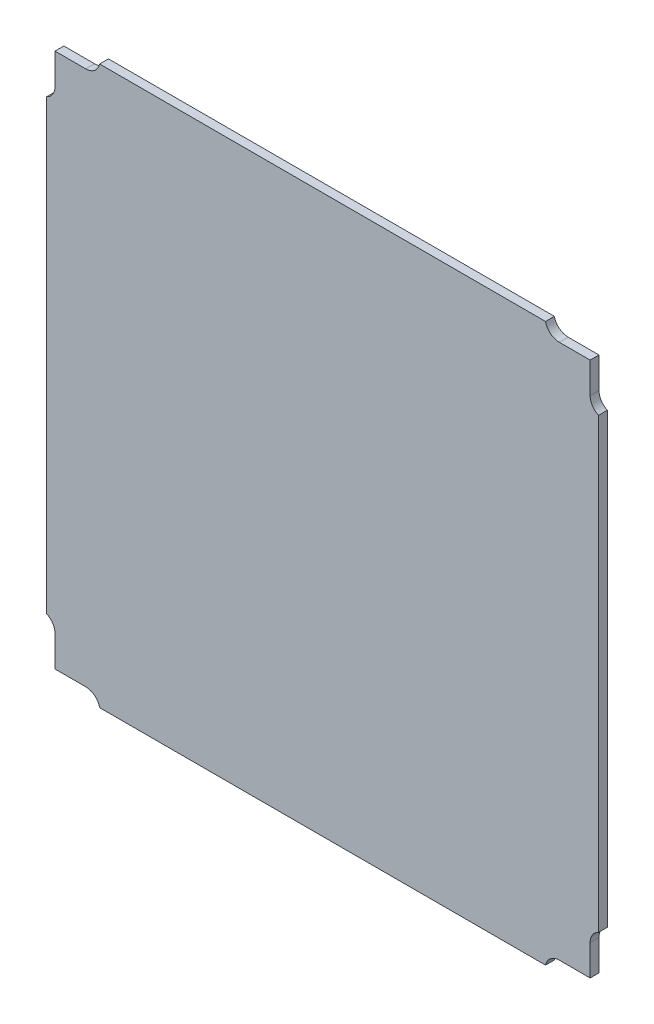
ISO-10303-21;
HEADER;
FILE_DESCRIPTION(('STEP AP214'),'2;1');
FILE_NAME('part.step','',(''),(''),'','','');
FILE_SCHEMA(('AUTOMOTIVE_DESIGN { 1 0 10303 214 1 1 1 1 }'));
ENDSEC;
DATA;
#1=APPLICATION_CONTEXT('core data for automotive mechanical design processes');
#2=APPLICATION_PROTOCOL_DEFINITION('international standard','automotive_design',2000,#1);
#3=PRODUCT_CONTEXT('',#1,'mechanical');
#4=PRODUCT('Part','Part','',(#3));
#5=PRODUCT_RELATED_PRODUCT_CATEGORY('part','',(#4));
#6=PRODUCT_DEFINITION_FORMATION('','',#4);
#7=PRODUCT_DEFINITION_CONTEXT('part definition',#1,'design');
#8=PRODUCT_DEFINITION('design','',#6,#7);
#9=PRODUCT_DEFINITION_SHAPE('','',#8);
#10=(LENGTH_UNIT() NAMED_UNIT(*) SI_UNIT(.MILLI.,.METRE.));
#11=(NAMED_UNIT(*) PLANE_ANGLE_UNIT() SI_UNIT($,.RADIAN.));
#12=(NAMED_UNIT(*) SI_UNIT($,.STERADIAN.) SOLID_ANGLE_UNIT());
#13=UNCERTAINTY_MEASURE_WITH_UNIT(LENGTH_MEASURE(1.E-05),#10,'distance_accuracy_value','');
#14=(GEOMETRIC_REPRESENTATION_CONTEXT(3) GLOBAL_UNCERTAINTY_ASSIGNED_CONTEXT((#13)) GLOBAL_UNIT_ASSIGNED_CONTEXT((#10,
#11,#12)) REPRESENTATION_CONTEXT('',''));
#15=CARTESIAN_POINT('',(0.,0.,0.));
#16=DIRECTION('',(0.,0.,1.));
#17=DIRECTION('',(1.,0.,0.));
#18=AXIS2_PLACEMENT_3D('',#15,#16,#17);
#19=CARTESIAN_POINT('',(0.,0.,1.5875));
#20=DIRECTION('',(0.,0.,1.));
#21=DIRECTION('',(1.,0.,0.));
#22=AXIS2_PLACEMENT_3D('',#19,#20,#21);
#23=PLANE('',#22);
#24=CARTESIAN_POINT('',(-50.54,42.4819347291982,1.5875));
#25=DIRECTION('',(0.,0.,1.));
#26=DIRECTION('',(1.,0.,0.));
#27=AXIS2_PLACEMENT_3D('',#24,#25,#26);
#28=CIRCLE('',#27,2.54);
#29=CARTESIAN_POINT('',(-48.,42.4819347291981,1.5875));
#30=VERTEX_POINT('',#29);
#31=CARTESIAN_POINT('',(-49.5,40.1646086839469,1.5875));
#32=VERTEX_POINT('',#31);
#33=EDGE_CURVE('E188',#30,#32,#28,.F.);
#34=ORIENTED_EDGE('',*,*,#33,.T.);
#35=DIRECTION('',(0.,-1.,0.));
#36=VECTOR('',#35,1.);
#37=CARTESIAN_POINT('',(-49.5,50.,1.5875));
#38=LINE('',#37,#36);
#39=CARTESIAN_POINT('',(-49.5,-40.1646086839469,1.5875));
#40=VERTEX_POINT('',#39);
#41=EDGE_CURVE('E61',#32,#40,#38,.T.);
#42=ORIENTED_EDGE('',*,*,#41,.T.);
#43=CARTESIAN_POINT('',(-50.54,-42.4819347291982,1.5875));
#44=DIRECTION('',(0.,0.,1.));
#45=DIRECTION('',(1.,0.,0.));
#46=AXIS2_PLACEMENT_3D('',#43,#44,#45);
#47=CIRCLE('',#46,2.54);
#48=CARTESIAN_POINT('',(-48.,-42.4819347291982,1.5875));
#49=VERTEX_POINT('',#48);
#50=EDGE_CURVE('E184',#40,#49,#47,.F.);
#51=ORIENTED_EDGE('',*,*,#50,.T.);
#52=DIRECTION('',(0.,-1.,0.));
#53=VECTOR('',#52,1.);
#54=CARTESIAN_POINT('',(-47.9999999999999,0.,1.5875));
#55=LINE('',#54,#53);
#56=CARTESIAN_POINT('',(-48.,-48.,1.5875));
#57=VERTEX_POINT('',#56);
#58=EDGE_CURVE('E281',#49,#57,#55,.T.);
#59=ORIENTED_EDGE('',*,*,#58,.T.);
#60=DIRECTION('',(1.,0.,0.));
#61=VECTOR('',#60,1.);
#62=CARTESIAN_POINT('',(0.,-48.0000000000001,1.5875));
#63=LINE('',#62,#61);
#64=CARTESIAN_POINT('',(-42.4819347291981,-48.,1.5875));
#65=VERTEX_POINT('',#64);
#66=EDGE_CURVE('E284',#57,#65,#63,.T.);
#67=ORIENTED_EDGE('',*,*,#66,.T.);
#68=CARTESIAN_POINT('',(-42.4819347291981,-50.54,1.5875));
#69=DIRECTION('',(0.,0.,1.));
#70=DIRECTION('',(1.,0.,0.));
#71=AXIS2_PLACEMENT_3D('',#68,#69,#70);
#72=CIRCLE('',#71,2.54);
#73=CARTESIAN_POINT('',(-40.,-50.,1.5875));
#74=VERTEX_POINT('',#73);
#75=EDGE_CURVE('E198',#65,#74,#72,.F.);
#76=ORIENTED_EDGE('',*,*,#75,.T.);
#77=DIRECTION('',(1.,0.,0.));
#78=VECTOR('',#77,1.);
#79=CARTESIAN_POINT('',(0.,-50.,1.5875));
#80=LINE('',#79,#78);
#81=CARTESIAN_POINT('',(40.,-50.,1.5875));
#82=VERTEX_POINT('',#81);
#83=EDGE_CURVE('E326',#74,#82,#80,.T.);
#84=ORIENTED_EDGE('',*,*,#83,.T.);
#85=CARTESIAN_POINT('',(42.4819347291982,-50.54,1.5875));
#86=DIRECTION('',(0.,0.,1.));
#87=DIRECTION('',(1.,0.,0.));
#88=AXIS2_PLACEMENT_3D('',#85,#86,#87);
#89=CIRCLE('',#88,2.54);
#90=CARTESIAN_POINT('',(42.4819347291982,-48.,1.5875));
#91=VERTEX_POINT('',#90);
#92=EDGE_CURVE('E207',#82,#91,#89,.F.);
#93=ORIENTED_EDGE('',*,*,#92,.T.);
#94=DIRECTION('',(1.,0.,0.));
#95=VECTOR('',#94,1.);
#96=CARTESIAN_POINT('',(-1.2490009027033E-13,-47.9999999999999,1.5875));
#97=LINE('',#96,#95);
#98=CARTESIAN_POINT('',(48.,-48.,1.5875));
#99=VERTEX_POINT('',#98);
#100=EDGE_CURVE('E324',#91,#99,#97,.T.);
#101=ORIENTED_EDGE('',*,*,#100,.T.);
#102=DIRECTION('',(0.,1.,0.));
#103=VECTOR('',#102,1.);
#104=CARTESIAN_POINT('',(48.0000000000001,0.,1.5875));
#105=LINE('',#104,#103);
#106=CARTESIAN_POINT('',(48.,-42.4819347291982,1.5875));
#107=VERTEX_POINT('',#106);
#108=EDGE_CURVE('E321',#99,#107,#105,.T.);
#109=ORIENTED_EDGE('',*,*,#108,.T.);
#110=CARTESIAN_POINT('',(50.54,-42.4819347291982,1.5875));
#111=DIRECTION('',(0.,0.,1.));
#112=DIRECTION('',(1.,0.,0.));
#113=AXIS2_PLACEMENT_3D('',#110,#111,#112);
#114=CIRCLE('',#113,2.54);
#115=CARTESIAN_POINT('',(49.5,-40.1646086839469,1.5875));
#116=VERTEX_POINT('',#115);
#117=EDGE_CURVE('E211',#107,#116,#114,.F.);
#118=ORIENTED_EDGE('',*,*,#117,.T.);
#119=DIRECTION('',(0.,1.,0.));
#120=VECTOR('',#119,1.);
#121=CARTESIAN_POINT('',(49.5,50.,1.5875));
#122=LINE('',#121,#120);
#123=CARTESIAN_POINT('',(49.5,40.1646086839469,1.5875));
#124=VERTEX_POINT('',#123);
#125=EDGE_CURVE('E189',#116,#124,#122,.T.);
#126=ORIENTED_EDGE('',*,*,#125,.T.);
#127=CARTESIAN_POINT('',(50.54,42.4819347291981,1.5875));
#128=DIRECTION('',(0.,0.,1.));
#129=DIRECTION('',(1.,0.,0.));
#130=AXIS2_PLACEMENT_3D('',#127,#128,#129);
#131=CIRCLE('',#130,2.54);
#132=CARTESIAN_POINT('',(48.,42.4819347291982,1.5875));
#133=VERTEX_POINT('',#132);
#134=EDGE_CURVE('E217',#124,#133,#131,.F.);
#135=ORIENTED_EDGE('',*,*,#134,.T.);
#136=DIRECTION('',(0.,1.,0.));
#137=VECTOR('',#136,1.);
#138=CARTESIAN_POINT('',(47.9999999999999,-1.2490009027033E-13,1.5875));
#139=LINE('',#138,#137);
#140=CARTESIAN_POINT('',(48.,48.,1.5875));
#141=VERTEX_POINT('',#140);
#142=EDGE_CURVE('E319',#133,#141,#139,.T.);
#143=ORIENTED_EDGE('',*,*,#142,.T.);
#144=DIRECTION('',(-1.,0.,0.));
#145=VECTOR('',#144,1.);
#146=CARTESIAN_POINT('',(1.2490009027033E-13,48.0000000000001,1.5875));
#147=LINE('',#146,#145);
#148=CARTESIAN_POINT('',(42.4819347291982,48.,1.5875));
#149=VERTEX_POINT('',#148);
#150=EDGE_CURVE('E316',#141,#149,#147,.T.);
#151=ORIENTED_EDGE('',*,*,#150,.T.);
#152=CARTESIAN_POINT('',(42.4819347291982,50.54,1.5875));
#153=DIRECTION('',(0.,0.,1.));
#154=DIRECTION('',(1.,0.,0.));
#155=AXIS2_PLACEMENT_3D('',#152,#153,#154);
#156=CIRCLE('',#155,2.54);
#157=CARTESIAN_POINT('',(40.,50.,1.5875));
#158=VERTEX_POINT('',#157);
#159=EDGE_CURVE('E221',#149,#158,#156,.F.);
#160=ORIENTED_EDGE('',*,*,#159,.T.);
#161=DIRECTION('',(1.,0.,0.));
#162=VECTOR('',#161,1.);
#163=CARTESIAN_POINT('',(0.,50.,1.5875));
#164=LINE('',#163,#162);
#165=CARTESIAN_POINT('',(-40.,50.,1.5875));
#166=VERTEX_POINT('',#165);
#167=EDGE_CURVE('E313',#166,#158,#164,.T.);
#168=ORIENTED_EDGE('',*,*,#167,.F.);
#169=CARTESIAN_POINT('',(-42.4819347291982,50.54,1.5875));
#170=DIRECTION('',(0.,0.,1.));
#171=DIRECTION('',(1.,0.,0.));
#172=AXIS2_PLACEMENT_3D('',#169,#170,#171);
#173=CIRCLE('',#172,2.54);
#174=CARTESIAN_POINT('',(-42.4819347291982,48.,1.5875));
#175=VERTEX_POINT('',#174);
#176=EDGE_CURVE('E225',#166,#175,#173,.F.);
#177=ORIENTED_EDGE('',*,*,#176,.T.);
#178=DIRECTION('',(-1.,0.,0.));
#179=VECTOR('',#178,1.);
#180=CARTESIAN_POINT('',(0.,47.9999999999999,1.5875));
#181=LINE('',#180,#179);
#182=CARTESIAN_POINT('',(-48.,48.,1.5875));
#183=VERTEX_POINT('',#182);
#184=EDGE_CURVE('E311',#175,#183,#181,.T.);
#185=ORIENTED_EDGE('',*,*,#184,.T.);
#186=DIRECTION('',(0.,-1.,0.));
#187=VECTOR('',#186,1.);
#188=CARTESIAN_POINT('',(-48.0000000000001,0.,1.5875));
#189=LINE('',#188,#187);
#190=EDGE_CURVE('E309',#183,#30,#189,.T.);
#191=ORIENTED_EDGE('',*,*,#190,.T.);
#192=EDGE_LOOP('',(#34,#42,#51,#59,#67,#76,#84,#93,#101,#109,#118,#126,#135,#143,#151,#160,#168,
#177,#185,#191));
#193=FACE_BOUND('',#192,.T.);
#194=ADVANCED_FACE('F39',(#193),#23,.T.);
#195=CARTESIAN_POINT('',(0.,0.,0.));
#196=DIRECTION('',(0.,0.,1.));
#197=DIRECTION('',(1.,0.,0.));
#198=AXIS2_PLACEMENT_3D('',#195,#196,#197);
#199=PLANE('',#198);
#200=DIRECTION('',(0.,-1.,0.));
#201=VECTOR('',#200,1.);
#202=CARTESIAN_POINT('',(-49.5,50.,0.));
#203=LINE('',#202,#201);
#204=CARTESIAN_POINT('',(-49.5,40.1646086839469,0.));
#205=VERTEX_POINT('',#204);
#206=CARTESIAN_POINT('',(-49.5,-40.1646086839469,0.));
#207=VERTEX_POINT('',#206);
#208=EDGE_CURVE('E176',#205,#207,#203,.T.);
#209=ORIENTED_EDGE('',*,*,#208,.F.);
#210=CARTESIAN_POINT('',(-50.54,42.4819347291982,0.));
#211=DIRECTION('',(0.,0.,1.));
#212=DIRECTION('',(1.,0.,0.));
#213=AXIS2_PLACEMENT_3D('',#210,#211,#212);
#214=CIRCLE('',#213,2.54);
#215=CARTESIAN_POINT('',(-48.,42.4819347291981,0.));
#216=VERTEX_POINT('',#215);
#217=EDGE_CURVE('E227',#205,#216,#214,.T.);
#218=ORIENTED_EDGE('',*,*,#217,.T.);
#219=DIRECTION('',(0.,-1.,0.));
#220=VECTOR('',#219,1.);
#221=CARTESIAN_POINT('',(-48.0000000000001,0.,0.));
#222=LINE('',#221,#220);
#223=CARTESIAN_POINT('',(-48.,48.,0.));
#224=VERTEX_POINT('',#223);
#225=EDGE_CURVE('E285',#224,#216,#222,.T.);
#226=ORIENTED_EDGE('',*,*,#225,.F.);
#227=DIRECTION('',(-1.,0.,0.));
#228=VECTOR('',#227,1.);
#229=CARTESIAN_POINT('',(0.,47.9999999999999,0.));
#230=LINE('',#229,#228);
#231=CARTESIAN_POINT('',(-42.4819347291982,48.,0.));
#232=VERTEX_POINT('',#231);
#233=EDGE_CURVE('E287',#232,#224,#230,.T.);
#234=ORIENTED_EDGE('',*,*,#233,.F.);
#235=CARTESIAN_POINT('',(-42.4819347291982,50.54,0.));
#236=DIRECTION('',(0.,0.,1.));
#237=DIRECTION('',(1.,0.,0.));
#238=AXIS2_PLACEMENT_3D('',#235,#236,#237);
#239=CIRCLE('',#238,2.54);
#240=CARTESIAN_POINT('',(-40.,50.,0.));
#241=VERTEX_POINT('',#240);
#242=EDGE_CURVE('E223',#232,#241,#239,.T.);
#243=ORIENTED_EDGE('',*,*,#242,.T.);
#244=DIRECTION('',(1.,0.,0.));
#245=VECTOR('',#244,1.);
#246=CARTESIAN_POINT('',(0.,50.,0.));
#247=LINE('',#246,#245);
#248=CARTESIAN_POINT('',(40.,50.,0.));
#249=VERTEX_POINT('',#248);
#250=EDGE_CURVE('E289',#241,#249,#247,.T.);
#251=ORIENTED_EDGE('',*,*,#250,.T.);
#252=CARTESIAN_POINT('',(42.4819347291982,50.54,0.));
#253=DIRECTION('',(0.,0.,1.));
#254=DIRECTION('',(1.,0.,0.));
#255=AXIS2_PLACEMENT_3D('',#252,#253,#254);
#256=CIRCLE('',#255,2.54);
#257=CARTESIAN_POINT('',(42.4819347291982,48.,0.));
#258=VERTEX_POINT('',#257);
#259=EDGE_CURVE('E219',#249,#258,#256,.T.);
#260=ORIENTED_EDGE('',*,*,#259,.T.);
#261=DIRECTION('',(-1.,0.,0.));
#262=VECTOR('',#261,1.);
#263=CARTESIAN_POINT('',(1.2490009027033E-13,48.0000000000001,0.));
#264=LINE('',#263,#262);
#265=CARTESIAN_POINT('',(48.,48.,0.));
#266=VERTEX_POINT('',#265);
#267=EDGE_CURVE('E292',#266,#258,#264,.T.);
#268=ORIENTED_EDGE('',*,*,#267,.F.);
#269=DIRECTION('',(0.,1.,0.));
#270=VECTOR('',#269,1.);
#271=CARTESIAN_POINT('',(47.9999999999999,-1.2490009027033E-13,0.));
#272=LINE('',#271,#270);
#273=CARTESIAN_POINT('',(48.,42.4819347291982,0.));
#274=VERTEX_POINT('',#273);
#275=EDGE_CURVE('E295',#274,#266,#272,.T.);
#276=ORIENTED_EDGE('',*,*,#275,.F.);
#277=CARTESIAN_POINT('',(50.54,42.4819347291981,0.));
#278=DIRECTION('',(0.,0.,1.));
#279=DIRECTION('',(1.,0.,0.));
#280=AXIS2_PLACEMENT_3D('',#277,#278,#279);
#281=CIRCLE('',#280,2.54);
#282=CARTESIAN_POINT('',(49.5,40.1646086839469,0.));
#283=VERTEX_POINT('',#282);
#284=EDGE_CURVE('E214',#274,#283,#281,.T.);
#285=ORIENTED_EDGE('',*,*,#284,.T.);
#286=DIRECTION('',(0.,1.,0.));
#287=VECTOR('',#286,1.);
#288=CARTESIAN_POINT('',(49.5,50.,0.));
#289=LINE('',#288,#287);
#290=CARTESIAN_POINT('',(49.5,-40.1646086839469,0.));
#291=VERTEX_POINT('',#290);
#292=EDGE_CURVE('E53',#291,#283,#289,.T.);
#293=ORIENTED_EDGE('',*,*,#292,.F.);
#294=CARTESIAN_POINT('',(50.54,-42.4819347291982,0.));
#295=DIRECTION('',(0.,0.,1.));
#296=DIRECTION('',(1.,0.,0.));
#297=AXIS2_PLACEMENT_3D('',#294,#295,#296);
#298=CIRCLE('',#297,2.54);
#299=CARTESIAN_POINT('',(48.,-42.4819347291982,0.));
#300=VERTEX_POINT('',#299);
#301=EDGE_CURVE('E209',#291,#300,#298,.T.);
#302=ORIENTED_EDGE('',*,*,#301,.T.);
#303=DIRECTION('',(0.,1.,0.));
#304=VECTOR('',#303,1.);
#305=CARTESIAN_POINT('',(48.0000000000001,0.,0.));
#306=LINE('',#305,#304);
#307=CARTESIAN_POINT('',(48.,-48.,0.));
#308=VERTEX_POINT('',#307);
#309=EDGE_CURVE('E297',#308,#300,#306,.T.);
#310=ORIENTED_EDGE('',*,*,#309,.F.);
#311=DIRECTION('',(1.,0.,0.));
#312=VECTOR('',#311,1.);
#313=CARTESIAN_POINT('',(-1.2490009027033E-13,-47.9999999999999,0.));
#314=LINE('',#313,#312);
#315=CARTESIAN_POINT('',(42.4819347291982,-48.,0.));
#316=VERTEX_POINT('',#315);
#317=EDGE_CURVE('E300',#316,#308,#314,.T.);
#318=ORIENTED_EDGE('',*,*,#317,.F.);
#319=CARTESIAN_POINT('',(42.4819347291982,-50.54,0.));
#320=DIRECTION('',(0.,0.,1.));
#321=DIRECTION('',(1.,0.,0.));
#322=AXIS2_PLACEMENT_3D('',#319,#320,#321);
#323=CIRCLE('',#322,2.54);
#324=CARTESIAN_POINT('',(40.,-50.,0.));
#325=VERTEX_POINT('',#324);
#326=EDGE_CURVE('E205',#316,#325,#323,.T.);
#327=ORIENTED_EDGE('',*,*,#326,.T.);
#328=DIRECTION('',(1.,0.,0.));
#329=VECTOR('',#328,1.);
#330=CARTESIAN_POINT('',(0.,-50.,0.));
#331=LINE('',#330,#329);
#332=CARTESIAN_POINT('',(-40.,-50.,0.));
#333=VERTEX_POINT('',#332);
#334=EDGE_CURVE('E302',#333,#325,#331,.T.);
#335=ORIENTED_EDGE('',*,*,#334,.F.);
#336=CARTESIAN_POINT('',(-42.4819347291981,-50.54,0.));
#337=DIRECTION('',(0.,0.,1.));
#338=DIRECTION('',(1.,0.,0.));
#339=AXIS2_PLACEMENT_3D('',#336,#337,#338);
#340=CIRCLE('',#339,2.54);
#341=CARTESIAN_POINT('',(-42.4819347291981,-48.,0.));
#342=VERTEX_POINT('',#341);
#343=EDGE_CURVE('E195',#333,#342,#340,.T.);
#344=ORIENTED_EDGE('',*,*,#343,.T.);
#345=DIRECTION('',(1.,0.,0.));
#346=VECTOR('',#345,1.);
#347=CARTESIAN_POINT('',(0.,-48.0000000000001,0.));
#348=LINE('',#347,#346);
#349=CARTESIAN_POINT('',(-48.,-48.,0.));
#350=VERTEX_POINT('',#349);
#351=EDGE_CURVE('E305',#350,#342,#348,.T.);
#352=ORIENTED_EDGE('',*,*,#351,.F.);
#353=DIRECTION('',(0.,-1.,0.));
#354=VECTOR('',#353,1.);
#355=CARTESIAN_POINT('',(-47.9999999999999,0.,0.));
#356=LINE('',#355,#354);
#357=CARTESIAN_POINT('',(-48.,-42.4819347291982,0.));
#358=VERTEX_POINT('',#357);
#359=EDGE_CURVE('E282',#358,#350,#356,.T.);
#360=ORIENTED_EDGE('',*,*,#359,.F.);
#361=CARTESIAN_POINT('',(-50.54,-42.4819347291982,0.));
#362=DIRECTION('',(0.,0.,1.));
#363=DIRECTION('',(1.,0.,0.));
#364=AXIS2_PLACEMENT_3D('',#361,#362,#363);
#365=CIRCLE('',#364,2.54);
#366=EDGE_CURVE('E196',#358,#207,#365,.T.);
#367=ORIENTED_EDGE('',*,*,#366,.T.);
#368=EDGE_LOOP('',(#209,#218,#226,#234,#243,#251,#260,#268,#276,#285,#293,#302,#310,#318,#327,
#335,#344,#352,#360,#367));
#369=FACE_BOUND('',#368,.T.);
#370=ADVANCED_FACE('F232',(#369),#199,.F.);
#371=CARTESIAN_POINT('',(-50.54,-42.4819347291982,1.5875));
#372=DIRECTION('',(0.,0.,1.));
#373=DIRECTION('',(1.,0.,0.));
#374=AXIS2_PLACEMENT_3D('',#371,#372,#373);
#375=CYLINDRICAL_SURFACE('',#374,2.54);
#376=DIRECTION('',(0.,0.,1.));
#377=VECTOR('',#376,1.);
#378=CARTESIAN_POINT('',(-49.5,-40.1646086839469,1.5875));
#379=LINE('',#378,#377);
#380=EDGE_CURVE('E173',#207,#40,#379,.T.);
#381=ORIENTED_EDGE('',*,*,#380,.F.);
#382=ORIENTED_EDGE('',*,*,#366,.F.);
#383=DIRECTION('',(0.,0.,1.));
#384=VECTOR('',#383,1.);
#385=CARTESIAN_POINT('',(-48.,-42.4819347291982,1.5875));
#386=LINE('',#385,#384);
#387=EDGE_CURVE('E194',#49,#358,#386,.F.);
#388=ORIENTED_EDGE('',*,*,#387,.F.);
#389=ORIENTED_EDGE('',*,*,#50,.F.);
#390=EDGE_LOOP('',(#381,#382,#388,#389));
#391=FACE_BOUND('',#390,.T.);
#392=ADVANCED_FACE('F192',(#391),#375,.F.);
#393=CARTESIAN_POINT('',(50.54,-42.4819347291982,1.5875));
#394=DIRECTION('',(0.,0.,1.));
#395=DIRECTION('',(1.,0.,0.));
#396=AXIS2_PLACEMENT_3D('',#393,#394,#395);
#397=CYLINDRICAL_SURFACE('',#396,2.54);
#398=DIRECTION('',(0.,0.,1.));
#399=VECTOR('',#398,1.);
#400=CARTESIAN_POINT('',(49.5,-40.1646086839469,1.5875));
#401=LINE('',#400,#399);
#402=EDGE_CURVE('E180',#116,#291,#401,.F.);
#403=ORIENTED_EDGE('',*,*,#402,.F.);
#404=ORIENTED_EDGE('',*,*,#117,.F.);
#405=DIRECTION('',(0.,0.,1.));
#406=VECTOR('',#405,1.);
#407=CARTESIAN_POINT('',(48.,-42.4819347291982,1.5875));
#408=LINE('',#407,#406);
#409=EDGE_CURVE('E249',#300,#107,#408,.T.);
#410=ORIENTED_EDGE('',*,*,#409,.F.);
#411=ORIENTED_EDGE('',*,*,#301,.F.);
#412=EDGE_LOOP('',(#403,#404,#410,#411));
#413=FACE_BOUND('',#412,.T.);
#414=ADVANCED_FACE('F394',(#413),#397,.F.);
#415=CARTESIAN_POINT('',(50.54,42.4819347291981,1.5875));
#416=DIRECTION('',(0.,0.,-1.));
#417=DIRECTION('',(-1.,0.,0.));
#418=AXIS2_PLACEMENT_3D('',#415,#416,#417);
#419=CYLINDRICAL_SURFACE('',#418,2.54);
#420=DIRECTION('',(0.,0.,-1.));
#421=VECTOR('',#420,1.);
#422=CARTESIAN_POINT('',(49.5,40.1646086839469,1.5875));
#423=LINE('',#422,#421);
#424=EDGE_CURVE('E12',#283,#124,#423,.F.);
#425=ORIENTED_EDGE('',*,*,#424,.F.);
#426=ORIENTED_EDGE('',*,*,#284,.F.);
#427=DIRECTION('',(0.,0.,-1.));
#428=VECTOR('',#427,1.);
#429=CARTESIAN_POINT('',(48.,42.4819347291982,1.5875));
#430=LINE('',#429,#428);
#431=EDGE_CURVE('E246',#133,#274,#430,.T.);
#432=ORIENTED_EDGE('',*,*,#431,.F.);
#433=ORIENTED_EDGE('',*,*,#134,.F.);
#434=EDGE_LOOP('',(#425,#426,#432,#433));
#435=FACE_BOUND('',#434,.T.);
#436=ADVANCED_FACE('F339',(#435),#419,.F.);
#437=CARTESIAN_POINT('',(-50.54,42.4819347291982,1.5875));
#438=DIRECTION('',(0.,0.,-1.));
#439=DIRECTION('',(-1.,0.,0.));
#440=AXIS2_PLACEMENT_3D('',#437,#438,#439);
#441=CYLINDRICAL_SURFACE('',#440,2.54);
#442=DIRECTION('',(0.,0.,-1.));
#443=VECTOR('',#442,1.);
#444=CARTESIAN_POINT('',(-49.5,40.1646086839469,1.5875));
#445=LINE('',#444,#443);
#446=EDGE_CURVE('E47',#32,#205,#445,.T.);
#447=ORIENTED_EDGE('',*,*,#446,.F.);
#448=ORIENTED_EDGE('',*,*,#33,.F.);
#449=DIRECTION('',(0.,0.,-1.));
#450=VECTOR('',#449,1.);
#451=CARTESIAN_POINT('',(-48.,42.4819347291981,1.5875));
#452=LINE('',#451,#450);
#453=EDGE_CURVE('E200',#216,#30,#452,.F.);
#454=ORIENTED_EDGE('',*,*,#453,.F.);
#455=ORIENTED_EDGE('',*,*,#217,.F.);
#456=EDGE_LOOP('',(#447,#448,#454,#455));
#457=FACE_BOUND('',#456,.T.);
#458=ADVANCED_FACE('F41',(#457),#441,.F.);
#459=CARTESIAN_POINT('',(0.,-48.0000000000001,1.5875));
#460=DIRECTION('',(0.,1.,0.));
#461=DIRECTION('',(-1.,0.,0.));
#462=AXIS2_PLACEMENT_3D('',#459,#460,#461);
#463=PLANE('',#462);
#464=ORIENTED_EDGE('',*,*,#351,.T.);
#465=DIRECTION('',(0.,0.,1.));
#466=VECTOR('',#465,1.);
#467=CARTESIAN_POINT('',(-42.4819347291981,-48.,1.5875));
#468=LINE('',#467,#466);
#469=EDGE_CURVE('E254',#342,#65,#468,.T.);
#470=ORIENTED_EDGE('',*,*,#469,.T.);
#471=ORIENTED_EDGE('',*,*,#66,.F.);
#472=DIRECTION('',(0.,0.,-1.));
#473=VECTOR('',#472,1.);
#474=CARTESIAN_POINT('',(-48.,-48.,1.5875));
#475=LINE('',#474,#473);
#476=EDGE_CURVE('E278',#57,#350,#475,.T.);
#477=ORIENTED_EDGE('',*,*,#476,.T.);
#478=EDGE_LOOP('',(#464,#470,#471,#477));
#479=FACE_BOUND('',#478,.T.);
#480=ADVANCED_FACE('F451',(#479),#463,.F.);
#481=CARTESIAN_POINT('',(0.,-50.,1.5875));
#482=DIRECTION('',(0.,1.,0.));
#483=DIRECTION('',(0.,0.,1.));
#484=AXIS2_PLACEMENT_3D('',#481,#482,#483);
#485=PLANE('',#484);
#486=ORIENTED_EDGE('',*,*,#334,.T.);
#487=DIRECTION('',(0.,0.,-1.));
#488=VECTOR('',#487,1.);
#489=CARTESIAN_POINT('',(40.,-50.,1.5875));
#490=LINE('',#489,#488);
#491=EDGE_CURVE('E260',#82,#325,#490,.T.);
#492=ORIENTED_EDGE('',*,*,#491,.F.);
#493=ORIENTED_EDGE('',*,*,#83,.F.);
#494=DIRECTION('',(0.,0.,-1.));
#495=VECTOR('',#494,1.);
#496=CARTESIAN_POINT('',(-40.,-50.,1.5875));
#497=LINE('',#496,#495);
#498=EDGE_CURVE('E257',#74,#333,#497,.T.);
#499=ORIENTED_EDGE('',*,*,#498,.T.);
#500=EDGE_LOOP('',(#486,#492,#493,#499));
#501=FACE_BOUND('',#500,.T.);
#502=ADVANCED_FACE('F409',(#501),#485,.F.);
#503=CARTESIAN_POINT('',(-1.2490009027033E-13,-47.9999999999999,1.5875));
#504=DIRECTION('',(0.,1.,0.));
#505=DIRECTION('',(-1.,0.,0.));
#506=AXIS2_PLACEMENT_3D('',#503,#504,#505);
#507=PLANE('',#506);
#508=ORIENTED_EDGE('',*,*,#100,.F.);
#509=DIRECTION('',(0.,0.,-1.));
#510=VECTOR('',#509,1.);
#511=CARTESIAN_POINT('',(42.4819347291982,-48.,1.5875));
#512=LINE('',#511,#510);
#513=EDGE_CURVE('E251',#91,#316,#512,.T.);
#514=ORIENTED_EDGE('',*,*,#513,.T.);
#515=ORIENTED_EDGE('',*,*,#317,.T.);
#516=DIRECTION('',(0.,0.,-1.));
#517=VECTOR('',#516,1.);
#518=CARTESIAN_POINT('',(48.,-48.,1.5875));
#519=LINE('',#518,#517);
#520=EDGE_CURVE('E263',#99,#308,#519,.T.);
#521=ORIENTED_EDGE('',*,*,#520,.F.);
#522=EDGE_LOOP('',(#508,#514,#515,#521));
#523=FACE_BOUND('',#522,.T.);
#524=ADVANCED_FACE('F403',(#523),#507,.F.);
#525=CARTESIAN_POINT('',(48.0000000000001,0.,1.5875));
#526=DIRECTION('',(-1.,0.,0.));
#527=DIRECTION('',(0.,-1.,0.));
#528=AXIS2_PLACEMENT_3D('',#525,#526,#527);
#529=PLANE('',#528);
#530=ORIENTED_EDGE('',*,*,#309,.T.);
#531=ORIENTED_EDGE('',*,*,#409,.T.);
#532=ORIENTED_EDGE('',*,*,#108,.F.);
#533=ORIENTED_EDGE('',*,*,#520,.T.);
#534=EDGE_LOOP('',(#530,#531,#532,#533));
#535=FACE_BOUND('',#534,.T.);
#536=ADVANCED_FACE('F397',(#535),#529,.F.);
#537=CARTESIAN_POINT('',(47.9999999999999,-1.2490009027033E-13,1.5875));
#538=DIRECTION('',(-1.,0.,0.));
#539=DIRECTION('',(0.,-1.,0.));
#540=AXIS2_PLACEMENT_3D('',#537,#538,#539);
#541=PLANE('',#540);
#542=ORIENTED_EDGE('',*,*,#142,.F.);
#543=ORIENTED_EDGE('',*,*,#431,.T.);
#544=ORIENTED_EDGE('',*,*,#275,.T.);
#545=DIRECTION('',(0.,0.,-1.));
#546=VECTOR('',#545,1.);
#547=CARTESIAN_POINT('',(48.,48.,1.5875));
#548=LINE('',#547,#546);
#549=EDGE_CURVE('E266',#141,#266,#548,.T.);
#550=ORIENTED_EDGE('',*,*,#549,.F.);
#551=EDGE_LOOP('',(#542,#543,#544,#550));
#552=FACE_BOUND('',#551,.T.);
#553=ADVANCED_FACE('F342',(#552),#541,.F.);
#554=CARTESIAN_POINT('',(1.2490009027033E-13,48.0000000000001,1.5875));
#555=DIRECTION('',(0.,-1.,0.));
#556=DIRECTION('',(1.,0.,0.));
#557=AXIS2_PLACEMENT_3D('',#554,#555,#556);
#558=PLANE('',#557);
#559=ORIENTED_EDGE('',*,*,#267,.T.);
#560=DIRECTION('',(0.,0.,-1.));
#561=VECTOR('',#560,1.);
#562=CARTESIAN_POINT('',(42.4819347291982,48.,1.5875));
#563=LINE('',#562,#561);
#564=EDGE_CURVE('E242',#258,#149,#563,.F.);
#565=ORIENTED_EDGE('',*,*,#564,.T.);
#566=ORIENTED_EDGE('',*,*,#150,.F.);
#567=ORIENTED_EDGE('',*,*,#549,.T.);
#568=EDGE_LOOP('',(#559,#565,#566,#567));
#569=FACE_BOUND('',#568,.T.);
#570=ADVANCED_FACE('F347',(#569),#558,.F.);
#571=CARTESIAN_POINT('',(0.,50.,1.5875));
#572=DIRECTION('',(0.,1.,0.));
#573=DIRECTION('',(0.,0.,1.));
#574=AXIS2_PLACEMENT_3D('',#571,#572,#573);
#575=PLANE('',#574);
#576=ORIENTED_EDGE('',*,*,#250,.F.);
#577=DIRECTION('',(0.,0.,-1.));
#578=VECTOR('',#577,1.);
#579=CARTESIAN_POINT('',(-40.,50.,1.5875));
#580=LINE('',#579,#578);
#581=EDGE_CURVE('E272',#166,#241,#580,.T.);
#582=ORIENTED_EDGE('',*,*,#581,.F.);
#583=ORIENTED_EDGE('',*,*,#167,.T.);
#584=DIRECTION('',(0.,0.,-1.));
#585=VECTOR('',#584,1.);
#586=CARTESIAN_POINT('',(40.,50.,1.5875));
#587=LINE('',#586,#585);
#588=EDGE_CURVE('E269',#158,#249,#587,.T.);
#589=ORIENTED_EDGE('',*,*,#588,.T.);
#590=EDGE_LOOP('',(#576,#582,#583,#589));
#591=FACE_BOUND('',#590,.T.);
#592=ADVANCED_FACE('F357',(#591),#575,.T.);
#593=CARTESIAN_POINT('',(0.,47.9999999999999,1.5875));
#594=DIRECTION('',(0.,-1.,0.));
#595=DIRECTION('',(1.,0.,0.));
#596=AXIS2_PLACEMENT_3D('',#593,#594,#595);
#597=PLANE('',#596);
#598=ORIENTED_EDGE('',*,*,#184,.F.);
#599=DIRECTION('',(0.,0.,1.));
#600=VECTOR('',#599,1.);
#601=CARTESIAN_POINT('',(-42.4819347291982,48.,1.5875));
#602=LINE('',#601,#600);
#603=EDGE_CURVE('E240',#175,#232,#602,.F.);
#604=ORIENTED_EDGE('',*,*,#603,.T.);
#605=ORIENTED_EDGE('',*,*,#233,.T.);
#606=DIRECTION('',(0.,0.,-1.));
#607=VECTOR('',#606,1.);
#608=CARTESIAN_POINT('',(-48.,48.,1.5875));
#609=LINE('',#608,#607);
#610=EDGE_CURVE('E275',#183,#224,#609,.T.);
#611=ORIENTED_EDGE('',*,*,#610,.F.);
#612=EDGE_LOOP('',(#598,#604,#605,#611));
#613=FACE_BOUND('',#612,.T.);
#614=ADVANCED_FACE('F364',(#613),#597,.F.);
#615=CARTESIAN_POINT('',(-48.0000000000001,0.,1.5875));
#616=DIRECTION('',(1.,0.,0.));
#617=DIRECTION('',(0.,1.,0.));
#618=AXIS2_PLACEMENT_3D('',#615,#616,#617);
#619=PLANE('',#618);
#620=ORIENTED_EDGE('',*,*,#225,.T.);
#621=ORIENTED_EDGE('',*,*,#453,.T.);
#622=ORIENTED_EDGE('',*,*,#190,.F.);
#623=ORIENTED_EDGE('',*,*,#610,.T.);
#624=EDGE_LOOP('',(#620,#621,#622,#623));
#625=FACE_BOUND('',#624,.T.);
#626=ADVANCED_FACE('F366',(#625),#619,.F.);
#627=CARTESIAN_POINT('',(-47.9999999999999,0.,1.5875));
#628=DIRECTION('',(1.,0.,0.));
#629=DIRECTION('',(0.,1.,0.));
#630=AXIS2_PLACEMENT_3D('',#627,#628,#629);
#631=PLANE('',#630);
#632=ORIENTED_EDGE('',*,*,#58,.F.);
#633=ORIENTED_EDGE('',*,*,#387,.T.);
#634=ORIENTED_EDGE('',*,*,#359,.T.);
#635=ORIENTED_EDGE('',*,*,#476,.F.);
#636=EDGE_LOOP('',(#632,#633,#634,#635));
#637=FACE_BOUND('',#636,.T.);
#638=ADVANCED_FACE('F368',(#637),#631,.F.);
#639=CARTESIAN_POINT('',(-42.4819347291981,-50.54,1.5875));
#640=DIRECTION('',(0.,0.,1.));
#641=DIRECTION('',(1.,0.,0.));
#642=AXIS2_PLACEMENT_3D('',#639,#640,#641);
#643=CYLINDRICAL_SURFACE('',#642,2.54);
#644=ORIENTED_EDGE('',*,*,#75,.F.);
#645=ORIENTED_EDGE('',*,*,#469,.F.);
#646=ORIENTED_EDGE('',*,*,#343,.F.);
#647=ORIENTED_EDGE('',*,*,#498,.F.);
#648=EDGE_LOOP('',(#644,#645,#646,#647));
#649=FACE_BOUND('',#648,.T.);
#650=ADVANCED_FACE('F374',(#649),#643,.F.);
#651=CARTESIAN_POINT('',(42.4819347291982,-50.54,1.5875));
#652=DIRECTION('',(0.,0.,-1.));
#653=DIRECTION('',(-1.,0.,0.));
#654=AXIS2_PLACEMENT_3D('',#651,#652,#653);
#655=CYLINDRICAL_SURFACE('',#654,2.54);
#656=ORIENTED_EDGE('',*,*,#92,.F.);
#657=ORIENTED_EDGE('',*,*,#491,.T.);
#658=ORIENTED_EDGE('',*,*,#326,.F.);
#659=ORIENTED_EDGE('',*,*,#513,.F.);
#660=EDGE_LOOP('',(#656,#657,#658,#659));
#661=FACE_BOUND('',#660,.T.);
#662=ADVANCED_FACE('F412',(#661),#655,.F.);
#663=CARTESIAN_POINT('',(42.4819347291982,50.54,1.5875));
#664=DIRECTION('',(0.,0.,-1.));
#665=DIRECTION('',(-1.,0.,0.));
#666=AXIS2_PLACEMENT_3D('',#663,#664,#665);
#667=CYLINDRICAL_SURFACE('',#666,2.54);
#668=ORIENTED_EDGE('',*,*,#159,.F.);
#669=ORIENTED_EDGE('',*,*,#564,.F.);
#670=ORIENTED_EDGE('',*,*,#259,.F.);
#671=ORIENTED_EDGE('',*,*,#588,.F.);
#672=EDGE_LOOP('',(#668,#669,#670,#671));
#673=FACE_BOUND('',#672,.T.);
#674=ADVANCED_FACE('F351',(#673),#667,.F.);
#675=CARTESIAN_POINT('',(-42.4819347291982,50.54,1.5875));
#676=DIRECTION('',(0.,0.,1.));
#677=DIRECTION('',(1.,0.,0.));
#678=AXIS2_PLACEMENT_3D('',#675,#676,#677);
#679=CYLINDRICAL_SURFACE('',#678,2.54);
#680=ORIENTED_EDGE('',*,*,#176,.F.);
#681=ORIENTED_EDGE('',*,*,#581,.T.);
#682=ORIENTED_EDGE('',*,*,#242,.F.);
#683=ORIENTED_EDGE('',*,*,#603,.F.);
#684=EDGE_LOOP('',(#680,#681,#682,#683));
#685=FACE_BOUND('',#684,.T.);
#686=ADVANCED_FACE('F359',(#685),#679,.F.);
#687=CARTESIAN_POINT('',(-49.5,50.,0.));
#688=DIRECTION('',(-1.,0.,0.));
#689=DIRECTION('',(0.,-1.,0.));
#690=AXIS2_PLACEMENT_3D('',#687,#688,#689);
#691=PLANE('',#690);
#692=ORIENTED_EDGE('',*,*,#380,.T.);
#693=ORIENTED_EDGE('',*,*,#41,.F.);
#694=ORIENTED_EDGE('',*,*,#446,.T.);
#695=ORIENTED_EDGE('',*,*,#208,.T.);
#696=EDGE_LOOP('',(#692,#693,#694,#695));
#697=FACE_BOUND('',#696,.T.);
#698=ADVANCED_FACE('F174',(#697),#691,.T.);
#699=CARTESIAN_POINT('',(49.5,50.,0.));
#700=DIRECTION('',(1.,0.,0.));
#701=DIRECTION('',(0.,1.,0.));
#702=AXIS2_PLACEMENT_3D('',#699,#700,#701);
#703=PLANE('',#702);
#704=ORIENTED_EDGE('',*,*,#402,.T.);
#705=ORIENTED_EDGE('',*,*,#292,.T.);
#706=ORIENTED_EDGE('',*,*,#424,.T.);
#707=ORIENTED_EDGE('',*,*,#125,.F.);
#708=EDGE_LOOP('',(#704,#705,#706,#707));
#709=FACE_BOUND('',#708,.T.);
#710=ADVANCED_FACE('F386',(#709),#703,.T.);
#711=CLOSED_SHELL('',(#194,#370,#392,#414,#436,#458,#480,#502,#524,#536,#553,#570,#592,#614,
#626,#638,#650,#662,#674,#686,#698,#710));
#712=MANIFOLD_SOLID_BREP('B2',#711);
#713=ADVANCED_BREP_SHAPE_REPRESENTATION('',(#18,#712),#14);
#714=SHAPE_DEFINITION_REPRESENTATION(#9,#713);
ENDSEC;
END-ISO-10303-21;
